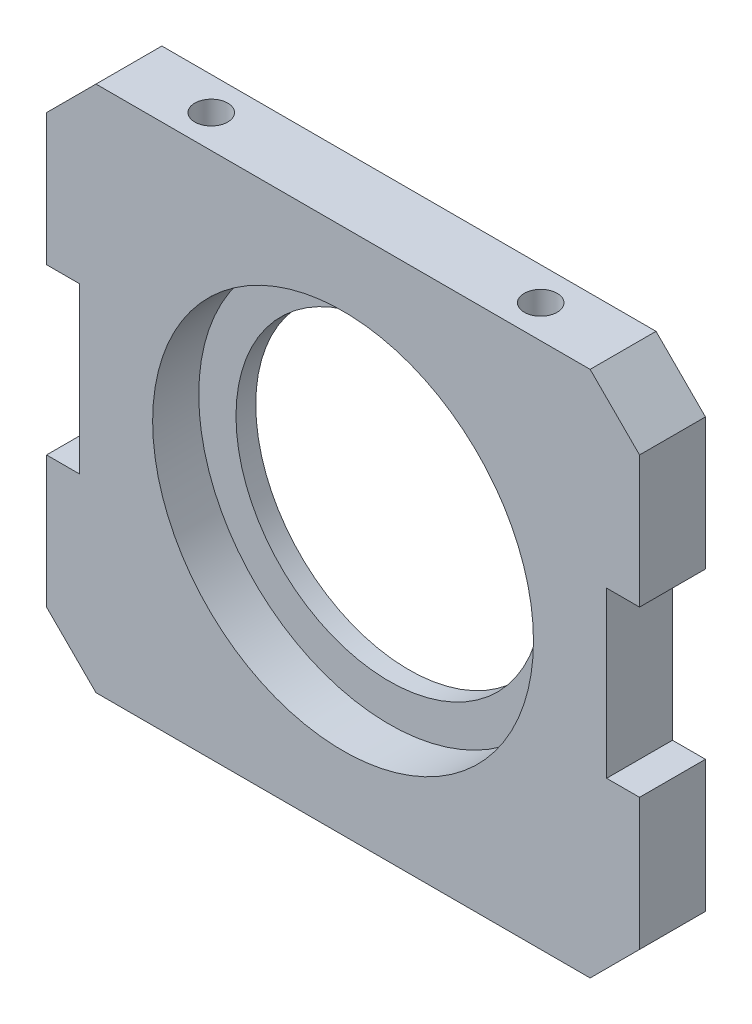
ISO-10303-21;
HEADER;
FILE_DESCRIPTION(('STEP AP214'),'2;1');
FILE_NAME('part.step','',(''),(''),'','','');
FILE_SCHEMA(('AUTOMOTIVE_DESIGN { 1 0 10303 214 1 1 1 1 }'));
ENDSEC;
DATA;
#1=APPLICATION_CONTEXT('core data for automotive mechanical design processes');
#2=APPLICATION_PROTOCOL_DEFINITION('international standard','automotive_design',2000,#1);
#3=PRODUCT_CONTEXT('',#1,'mechanical');
#4=PRODUCT('Part','Part','',(#3));
#5=PRODUCT_RELATED_PRODUCT_CATEGORY('part','',(#4));
#6=PRODUCT_DEFINITION_FORMATION('','',#4);
#7=PRODUCT_DEFINITION_CONTEXT('part definition',#1,'design');
#8=PRODUCT_DEFINITION('design','',#6,#7);
#9=PRODUCT_DEFINITION_SHAPE('','',#8);
#10=(LENGTH_UNIT() NAMED_UNIT(*) SI_UNIT(.MILLI.,.METRE.));
#11=(NAMED_UNIT(*) PLANE_ANGLE_UNIT() SI_UNIT($,.RADIAN.));
#12=(NAMED_UNIT(*) SI_UNIT($,.STERADIAN.) SOLID_ANGLE_UNIT());
#13=UNCERTAINTY_MEASURE_WITH_UNIT(LENGTH_MEASURE(1.E-05),#10,'distance_accuracy_value','');
#14=(GEOMETRIC_REPRESENTATION_CONTEXT(3) GLOBAL_UNCERTAINTY_ASSIGNED_CONTEXT((#13)) GLOBAL_UNIT_ASSIGNED_CONTEXT((#10,
#11,#12)) REPRESENTATION_CONTEXT('',''));
#15=CARTESIAN_POINT('',(0.,0.,0.));
#16=DIRECTION('',(0.,0.,1.));
#17=DIRECTION('',(1.,0.,0.));
#18=AXIS2_PLACEMENT_3D('',#15,#16,#17);
#19=CARTESIAN_POINT('',(45.,-40.,5.));
#20=DIRECTION('',(-1.,0.,0.));
#21=DIRECTION('',(0.,0.,1.));
#22=AXIS2_PLACEMENT_3D('',#19,#20,#21);
#23=PLANE('',#22);
#24=DIRECTION('',(0.,1.,0.));
#25=VECTOR('',#24,1.);
#26=CARTESIAN_POINT('',(45.,-40.,5.));
#27=LINE('',#26,#25);
#28=CARTESIAN_POINT('',(45.,-32.5,5.));
#29=VERTEX_POINT('',#28);
#30=CARTESIAN_POINT('',(45.,-12.5,5.));
#31=VERTEX_POINT('',#30);
#32=EDGE_CURVE('E235',#29,#31,#27,.T.);
#33=ORIENTED_EDGE('',*,*,#32,.F.);
#34=DIRECTION('',(0.,0.,-1.));
#35=VECTOR('',#34,1.);
#36=CARTESIAN_POINT('',(45.,-32.5,5.));
#37=LINE('',#36,#35);
#38=CARTESIAN_POINT('',(45.,-32.5,-5.));
#39=VERTEX_POINT('',#38);
#40=EDGE_CURVE('E288',#29,#39,#37,.T.);
#41=ORIENTED_EDGE('',*,*,#40,.T.);
#42=DIRECTION('',(0.,1.,0.));
#43=VECTOR('',#42,1.);
#44=CARTESIAN_POINT('',(45.,-40.,-5.));
#45=LINE('',#44,#43);
#46=CARTESIAN_POINT('',(45.,-12.5,-5.));
#47=VERTEX_POINT('',#46);
#48=EDGE_CURVE('E246',#39,#47,#45,.T.);
#49=ORIENTED_EDGE('',*,*,#48,.T.);
#50=DIRECTION('',(0.,0.,1.));
#51=VECTOR('',#50,1.);
#52=CARTESIAN_POINT('',(45.,-12.5,5.));
#53=LINE('',#52,#51);
#54=EDGE_CURVE('E263',#47,#31,#53,.T.);
#55=ORIENTED_EDGE('',*,*,#54,.T.);
#56=EDGE_LOOP('',(#33,#41,#49,#55));
#57=FACE_BOUND('',#56,.T.);
#58=ADVANCED_FACE('F43',(#57),#23,.F.);
#59=CARTESIAN_POINT('',(-45.,-40.,5.));
#60=DIRECTION('',(1.,0.,0.));
#61=DIRECTION('',(0.,0.,-1.));
#62=AXIS2_PLACEMENT_3D('',#59,#60,#61);
#63=PLANE('',#62);
#64=DIRECTION('',(0.,-1.,0.));
#65=VECTOR('',#64,1.);
#66=CARTESIAN_POINT('',(-45.,-40.,-5.));
#67=LINE('',#66,#65);
#68=CARTESIAN_POINT('',(-45.,-12.5,-5.));
#69=VERTEX_POINT('',#68);
#70=CARTESIAN_POINT('',(-45.,-32.5,-5.));
#71=VERTEX_POINT('',#70);
#72=EDGE_CURVE('E250',#69,#71,#67,.T.);
#73=ORIENTED_EDGE('',*,*,#72,.T.);
#74=DIRECTION('',(0.,0.,1.));
#75=VECTOR('',#74,1.);
#76=CARTESIAN_POINT('',(-45.,-32.5,5.));
#77=LINE('',#76,#75);
#78=CARTESIAN_POINT('',(-45.,-32.5,5.));
#79=VERTEX_POINT('',#78);
#80=EDGE_CURVE('E279',#71,#79,#77,.T.);
#81=ORIENTED_EDGE('',*,*,#80,.T.);
#82=DIRECTION('',(0.,-1.,0.));
#83=VECTOR('',#82,1.);
#84=CARTESIAN_POINT('',(-45.,-40.,5.));
#85=LINE('',#84,#83);
#86=CARTESIAN_POINT('',(-45.,-12.5,5.));
#87=VERTEX_POINT('',#86);
#88=EDGE_CURVE('E240',#87,#79,#85,.T.);
#89=ORIENTED_EDGE('',*,*,#88,.F.);
#90=DIRECTION('',(0.,0.,-1.));
#91=VECTOR('',#90,1.);
#92=CARTESIAN_POINT('',(-45.,-12.5,5.));
#93=LINE('',#92,#91);
#94=EDGE_CURVE('E257',#87,#69,#93,.T.);
#95=ORIENTED_EDGE('',*,*,#94,.T.);
#96=EDGE_LOOP('',(#73,#81,#89,#95));
#97=FACE_BOUND('',#96,.T.);
#98=ADVANCED_FACE('F322',(#97),#63,.F.);
#99=CARTESIAN_POINT('',(0.,0.,5.));
#100=DIRECTION('',(0.,0.,-1.));
#101=DIRECTION('',(-1.,0.,0.));
#102=AXIS2_PLACEMENT_3D('',#99,#100,#101);
#103=CYLINDRICAL_SURFACE('',#102,28.9);
#104=CARTESIAN_POINT('',(0.,0.,5.));
#105=DIRECTION('',(0.,0.,1.));
#106=DIRECTION('',(1.,0.,0.));
#107=AXIS2_PLACEMENT_3D('',#104,#105,#106);
#108=CIRCLE('',#107,28.9);
#109=CARTESIAN_POINT('',(28.9,0.,5.));
#110=VERTEX_POINT('',#109);
#111=EDGE_CURVE('E231',#110,#110,#108,.T.);
#112=ORIENTED_EDGE('',*,*,#111,.T.);
#113=EDGE_LOOP('',(#112));
#114=FACE_BOUND('',#113,.T.);
#115=CARTESIAN_POINT('',(0.,0.,-2.));
#116=DIRECTION('',(0.,0.,-1.));
#117=DIRECTION('',(-1.,0.,0.));
#118=AXIS2_PLACEMENT_3D('',#115,#116,#117);
#119=CIRCLE('',#118,28.9);
#120=CARTESIAN_POINT('',(-28.9,0.,-2.));
#121=VERTEX_POINT('',#120);
#122=EDGE_CURVE('E226',#121,#121,#119,.T.);
#123=ORIENTED_EDGE('',*,*,#122,.T.);
#124=EDGE_LOOP('',(#123));
#125=FACE_BOUND('',#124,.T.);
#126=ADVANCED_FACE('F362',(#114,#125),#103,.F.);
#127=CARTESIAN_POINT('',(0.,0.,5.));
#128=DIRECTION('',(0.,0.,-1.));
#129=DIRECTION('',(-1.,0.,0.));
#130=AXIS2_PLACEMENT_3D('',#127,#128,#129);
#131=PLANE('',#130);
#132=ORIENTED_EDGE('',*,*,#88,.T.);
#133=DIRECTION('',(-0.707106781186546,0.70710678118655,0.));
#134=VECTOR('',#133,1.);
#135=CARTESIAN_POINT('',(-37.5,-40.,5.));
#136=LINE('',#135,#134);
#137=CARTESIAN_POINT('',(-37.5,-40.,5.));
#138=VERTEX_POINT('',#137);
#139=EDGE_CURVE('E286',#79,#138,#136,.F.);
#140=ORIENTED_EDGE('',*,*,#139,.T.);
#141=DIRECTION('',(1.,0.,0.));
#142=VECTOR('',#141,1.);
#143=CARTESIAN_POINT('',(-45.,-40.,5.));
#144=LINE('',#143,#142);
#145=CARTESIAN_POINT('',(37.4999999999999,-40.,5.));
#146=VERTEX_POINT('',#145);
#147=EDGE_CURVE('E243',#138,#146,#144,.T.);
#148=ORIENTED_EDGE('',*,*,#147,.T.);
#149=DIRECTION('',(-0.70710678118655,-0.707106781186546,0.));
#150=VECTOR('',#149,1.);
#151=CARTESIAN_POINT('',(45.,-32.5,5.));
#152=LINE('',#151,#150);
#153=EDGE_CURVE('E284',#146,#29,#152,.F.);
#154=ORIENTED_EDGE('',*,*,#153,.T.);
#155=ORIENTED_EDGE('',*,*,#32,.T.);
#156=DIRECTION('',(1.,0.,0.));
#157=VECTOR('',#156,1.);
#158=CARTESIAN_POINT('',(50.,-12.5,5.));
#159=LINE('',#158,#157);
#160=CARTESIAN_POINT('',(40.,-12.5,5.));
#161=VERTEX_POINT('',#160);
#162=EDGE_CURVE('E208',#161,#31,#159,.T.);
#163=ORIENTED_EDGE('',*,*,#162,.F.);
#164=DIRECTION('',(0.,-1.,0.));
#165=VECTOR('',#164,1.);
#166=CARTESIAN_POINT('',(40.,-12.5,5.));
#167=LINE('',#166,#165);
#168=CARTESIAN_POINT('',(40.,12.5,5.));
#169=VERTEX_POINT('',#168);
#170=EDGE_CURVE('E211',#169,#161,#167,.T.);
#171=ORIENTED_EDGE('',*,*,#170,.F.);
#172=DIRECTION('',(-1.,0.,0.));
#173=VECTOR('',#172,1.);
#174=CARTESIAN_POINT('',(50.,12.5,5.));
#175=LINE('',#174,#173);
#176=CARTESIAN_POINT('',(45.,12.5,5.));
#177=VERTEX_POINT('',#176);
#178=EDGE_CURVE('E197',#177,#169,#175,.T.);
#179=ORIENTED_EDGE('',*,*,#178,.F.);
#180=CARTESIAN_POINT('',(45.,32.5,5.));
#181=VERTEX_POINT('',#180);
#182=EDGE_CURVE('E238',#177,#181,#27,.T.);
#183=ORIENTED_EDGE('',*,*,#182,.T.);
#184=DIRECTION('',(0.707106781186546,-0.70710678118655,0.));
#185=VECTOR('',#184,1.);
#186=CARTESIAN_POINT('',(37.5,40.,5.));
#187=LINE('',#186,#185);
#188=CARTESIAN_POINT('',(37.5,40.,5.));
#189=VERTEX_POINT('',#188);
#190=EDGE_CURVE('E282',#181,#189,#187,.F.);
#191=ORIENTED_EDGE('',*,*,#190,.T.);
#192=DIRECTION('',(-1.,0.,0.));
#193=VECTOR('',#192,1.);
#194=CARTESIAN_POINT('',(-45.,40.,5.));
#195=LINE('',#194,#193);
#196=CARTESIAN_POINT('',(-37.5,40.,5.));
#197=VERTEX_POINT('',#196);
#198=EDGE_CURVE('E237',#189,#197,#195,.T.);
#199=ORIENTED_EDGE('',*,*,#198,.T.);
#200=DIRECTION('',(0.70710678118655,0.707106781186546,0.));
#201=VECTOR('',#200,1.);
#202=CARTESIAN_POINT('',(-45.,32.5,5.));
#203=LINE('',#202,#201);
#204=CARTESIAN_POINT('',(-45.,32.5,5.));
#205=VERTEX_POINT('',#204);
#206=EDGE_CURVE('E59',#197,#205,#203,.F.);
#207=ORIENTED_EDGE('',*,*,#206,.T.);
#208=CARTESIAN_POINT('',(-45.,12.5,5.));
#209=VERTEX_POINT('',#208);
#210=EDGE_CURVE('E241',#205,#209,#85,.T.);
#211=ORIENTED_EDGE('',*,*,#210,.T.);
#212=DIRECTION('',(-1.,0.,0.));
#213=VECTOR('',#212,1.);
#214=CARTESIAN_POINT('',(-50.,12.5,5.));
#215=LINE('',#214,#213);
#216=CARTESIAN_POINT('',(-40.,12.5,5.));
#217=VERTEX_POINT('',#216);
#218=EDGE_CURVE('E189',#217,#209,#215,.T.);
#219=ORIENTED_EDGE('',*,*,#218,.F.);
#220=DIRECTION('',(0.,1.,0.));
#221=VECTOR('',#220,1.);
#222=CARTESIAN_POINT('',(-40.,-12.5,5.));
#223=LINE('',#222,#221);
#224=CARTESIAN_POINT('',(-40.,-12.5,5.));
#225=VERTEX_POINT('',#224);
#226=EDGE_CURVE('E167',#225,#217,#223,.T.);
#227=ORIENTED_EDGE('',*,*,#226,.F.);
#228=DIRECTION('',(1.,0.,0.));
#229=VECTOR('',#228,1.);
#230=CARTESIAN_POINT('',(-50.,-12.5,5.));
#231=LINE('',#230,#229);
#232=EDGE_CURVE('E187',#87,#225,#231,.T.);
#233=ORIENTED_EDGE('',*,*,#232,.F.);
#234=EDGE_LOOP('',(#132,#140,#148,#154,#155,#163,#171,#179,#183,#191,#199,#207,#211,#219,#227,#233));
#235=FACE_BOUND('',#234,.T.);
#236=ORIENTED_EDGE('',*,*,#111,.F.);
#237=EDGE_LOOP('',(#236));
#238=FACE_BOUND('',#237,.T.);
#239=ADVANCED_FACE('F305',(#235,#238),#131,.F.);
#240=CARTESIAN_POINT('',(0.,0.,-5.));
#241=DIRECTION('',(0.,0.,-1.));
#242=DIRECTION('',(-1.,0.,0.));
#243=AXIS2_PLACEMENT_3D('',#240,#241,#242);
#244=PLANE('',#243);
#245=DIRECTION('',(1.,0.,0.));
#246=VECTOR('',#245,1.);
#247=CARTESIAN_POINT('',(-45.,-40.,-5.));
#248=LINE('',#247,#246);
#249=CARTESIAN_POINT('',(-37.5,-40.,-5.));
#250=VERTEX_POINT('',#249);
#251=CARTESIAN_POINT('',(37.4999999999999,-40.,-5.));
#252=VERTEX_POINT('',#251);
#253=EDGE_CURVE('E253',#250,#252,#248,.T.);
#254=ORIENTED_EDGE('',*,*,#253,.F.);
#255=DIRECTION('',(0.707106781186546,-0.70710678118655,0.));
#256=VECTOR('',#255,1.);
#257=CARTESIAN_POINT('',(-38.7500000000001,-38.7499999999999,-5.));
#258=LINE('',#257,#256);
#259=EDGE_CURVE('E277',#250,#71,#258,.F.);
#260=ORIENTED_EDGE('',*,*,#259,.T.);
#261=ORIENTED_EDGE('',*,*,#72,.F.);
#262=DIRECTION('',(1.,0.,0.));
#263=VECTOR('',#262,1.);
#264=CARTESIAN_POINT('',(-50.,-12.5,-5.));
#265=LINE('',#264,#263);
#266=CARTESIAN_POINT('',(-40.,-12.5,-5.));
#267=VERTEX_POINT('',#266);
#268=EDGE_CURVE('E172',#69,#267,#265,.T.);
#269=ORIENTED_EDGE('',*,*,#268,.T.);
#270=DIRECTION('',(0.,1.,0.));
#271=VECTOR('',#270,1.);
#272=CARTESIAN_POINT('',(-40.,-12.5,-5.));
#273=LINE('',#272,#271);
#274=CARTESIAN_POINT('',(-40.,12.5,-5.));
#275=VERTEX_POINT('',#274);
#276=EDGE_CURVE('E164',#267,#275,#273,.T.);
#277=ORIENTED_EDGE('',*,*,#276,.T.);
#278=DIRECTION('',(-1.,0.,0.));
#279=VECTOR('',#278,1.);
#280=CARTESIAN_POINT('',(-50.,12.5,-5.));
#281=LINE('',#280,#279);
#282=CARTESIAN_POINT('',(-45.,12.5,-5.));
#283=VERTEX_POINT('',#282);
#284=EDGE_CURVE('E176',#275,#283,#281,.T.);
#285=ORIENTED_EDGE('',*,*,#284,.T.);
#286=CARTESIAN_POINT('',(-45.,32.5,-5.));
#287=VERTEX_POINT('',#286);
#288=EDGE_CURVE('E251',#287,#283,#67,.T.);
#289=ORIENTED_EDGE('',*,*,#288,.F.);
#290=DIRECTION('',(-0.70710678118655,-0.707106781186546,0.));
#291=VECTOR('',#290,1.);
#292=CARTESIAN_POINT('',(-38.7499999999999,38.7500000000001,-5.));
#293=LINE('',#292,#291);
#294=CARTESIAN_POINT('',(-37.5,40.,-5.));
#295=VERTEX_POINT('',#294);
#296=EDGE_CURVE('E271',#287,#295,#293,.F.);
#297=ORIENTED_EDGE('',*,*,#296,.T.);
#298=DIRECTION('',(-1.,0.,0.));
#299=VECTOR('',#298,1.);
#300=CARTESIAN_POINT('',(-45.,40.,-5.));
#301=LINE('',#300,#299);
#302=CARTESIAN_POINT('',(37.5,40.,-5.));
#303=VERTEX_POINT('',#302);
#304=EDGE_CURVE('E248',#303,#295,#301,.T.);
#305=ORIENTED_EDGE('',*,*,#304,.F.);
#306=DIRECTION('',(-0.707106781186546,0.70710678118655,0.));
#307=VECTOR('',#306,1.);
#308=CARTESIAN_POINT('',(38.7500000000001,38.7499999999999,-5.));
#309=LINE('',#308,#307);
#310=CARTESIAN_POINT('',(45.,32.5,-5.));
#311=VERTEX_POINT('',#310);
#312=EDGE_CURVE('E273',#303,#311,#309,.F.);
#313=ORIENTED_EDGE('',*,*,#312,.T.);
#314=CARTESIAN_POINT('',(45.,12.5,-5.));
#315=VERTEX_POINT('',#314);
#316=EDGE_CURVE('E234',#315,#311,#45,.T.);
#317=ORIENTED_EDGE('',*,*,#316,.F.);
#318=DIRECTION('',(-1.,0.,0.));
#319=VECTOR('',#318,1.);
#320=CARTESIAN_POINT('',(50.,12.5,-5.));
#321=LINE('',#320,#319);
#322=CARTESIAN_POINT('',(40.,12.5,-5.));
#323=VERTEX_POINT('',#322);
#324=EDGE_CURVE('E212',#315,#323,#321,.T.);
#325=ORIENTED_EDGE('',*,*,#324,.T.);
#326=DIRECTION('',(0.,-1.,0.));
#327=VECTOR('',#326,1.);
#328=CARTESIAN_POINT('',(40.,-12.5,-5.));
#329=LINE('',#328,#327);
#330=CARTESIAN_POINT('',(40.,-12.5,-5.));
#331=VERTEX_POINT('',#330);
#332=EDGE_CURVE('E218',#323,#331,#329,.T.);
#333=ORIENTED_EDGE('',*,*,#332,.T.);
#334=DIRECTION('',(1.,0.,0.));
#335=VECTOR('',#334,1.);
#336=CARTESIAN_POINT('',(50.,-12.5,-5.));
#337=LINE('',#336,#335);
#338=EDGE_CURVE('E204',#331,#47,#337,.T.);
#339=ORIENTED_EDGE('',*,*,#338,.T.);
#340=ORIENTED_EDGE('',*,*,#48,.F.);
#341=DIRECTION('',(0.70710678118655,0.707106781186546,0.));
#342=VECTOR('',#341,1.);
#343=CARTESIAN_POINT('',(38.7499999999999,-38.7500000000001,-5.));
#344=LINE('',#343,#342);
#345=EDGE_CURVE('E275',#39,#252,#344,.F.);
#346=ORIENTED_EDGE('',*,*,#345,.T.);
#347=EDGE_LOOP('',(#254,#260,#261,#269,#277,#285,#289,#297,#305,#313,#317,#325,#333,#339,#340,#346));
#348=FACE_BOUND('',#347,.T.);
#349=CARTESIAN_POINT('',(0.,0.,-5.));
#350=DIRECTION('',(0.,0.,-1.));
#351=DIRECTION('',(-1.,0.,0.));
#352=AXIS2_PLACEMENT_3D('',#349,#350,#351);
#353=CIRCLE('',#352,23.25);
#354=CARTESIAN_POINT('',(-23.25,0.,-5.));
#355=VERTEX_POINT('',#354);
#356=EDGE_CURVE('E199',#355,#355,#353,.T.);
#357=ORIENTED_EDGE('',*,*,#356,.F.);
#358=EDGE_LOOP('',(#357));
#359=FACE_BOUND('',#358,.T.);
#360=ADVANCED_FACE('F184',(#348,#359),#244,.T.);
#361=ORIENTED_EDGE('',*,*,#316,.T.);
#362=DIRECTION('',(0.,0.,1.));
#363=VECTOR('',#362,1.);
#364=CARTESIAN_POINT('',(45.,32.5,5.));
#365=LINE('',#364,#363);
#366=EDGE_CURVE('E52',#311,#181,#365,.T.);
#367=ORIENTED_EDGE('',*,*,#366,.T.);
#368=ORIENTED_EDGE('',*,*,#182,.F.);
#369=DIRECTION('',(0.,0.,-1.));
#370=VECTOR('',#369,1.);
#371=CARTESIAN_POINT('',(45.,12.5,5.));
#372=LINE('',#371,#370);
#373=EDGE_CURVE('E260',#177,#315,#372,.T.);
#374=ORIENTED_EDGE('',*,*,#373,.T.);
#375=EDGE_LOOP('',(#361,#367,#368,#374));
#376=FACE_BOUND('',#375,.T.);
#377=ADVANCED_FACE('F299',(#376),#23,.F.);
#378=CARTESIAN_POINT('',(-45.,40.,5.));
#379=DIRECTION('',(0.,-1.,0.));
#380=DIRECTION('',(0.,0.,-1.));
#381=AXIS2_PLACEMENT_3D('',#378,#379,#380);
#382=PLANE('',#381);
#383=CARTESIAN_POINT('',(-25.,40.,0.));
#384=DIRECTION('',(0.,-1.,0.));
#385=DIRECTION('',(0.,0.,-1.));
#386=AXIS2_PLACEMENT_3D('',#383,#384,#385);
#387=CIRCLE('',#386,2.5);
#388=CARTESIAN_POINT('',(-25.,40.,-2.5));
#389=VERTEX_POINT('',#388);
#390=EDGE_CURVE('E614',#389,#389,#387,.T.);
#391=ORIENTED_EDGE('',*,*,#390,.T.);
#392=EDGE_LOOP('',(#391));
#393=FACE_BOUND('',#392,.T.);
#394=CARTESIAN_POINT('',(25.,40.,0.));
#395=DIRECTION('',(0.,-1.,0.));
#396=DIRECTION('',(0.,0.,-1.));
#397=AXIS2_PLACEMENT_3D('',#394,#395,#396);
#398=CIRCLE('',#397,2.5);
#399=CARTESIAN_POINT('',(25.,40.,-2.49999999999999));
#400=VERTEX_POINT('',#399);
#401=EDGE_CURVE('E624',#400,#400,#398,.T.);
#402=ORIENTED_EDGE('',*,*,#401,.T.);
#403=EDGE_LOOP('',(#402));
#404=FACE_BOUND('',#403,.T.);
#405=ORIENTED_EDGE('',*,*,#198,.F.);
#406=DIRECTION('',(0.,0.,-1.));
#407=VECTOR('',#406,1.);
#408=CARTESIAN_POINT('',(37.5,40.,5.));
#409=LINE('',#408,#407);
#410=EDGE_CURVE('E292',#189,#303,#409,.T.);
#411=ORIENTED_EDGE('',*,*,#410,.T.);
#412=ORIENTED_EDGE('',*,*,#304,.T.);
#413=DIRECTION('',(0.,0.,1.));
#414=VECTOR('',#413,1.);
#415=CARTESIAN_POINT('',(-37.5,40.,5.));
#416=LINE('',#415,#414);
#417=EDGE_CURVE('E67',#295,#197,#416,.T.);
#418=ORIENTED_EDGE('',*,*,#417,.T.);
#419=EDGE_LOOP('',(#405,#411,#412,#418));
#420=FACE_BOUND('',#419,.T.);
#421=ADVANCED_FACE('F311',(#393,#404,#420),#382,.F.);
#422=ORIENTED_EDGE('',*,*,#210,.F.);
#423=DIRECTION('',(0.,0.,-1.));
#424=VECTOR('',#423,1.);
#425=CARTESIAN_POINT('',(-45.,32.5,5.));
#426=LINE('',#425,#424);
#427=EDGE_CURVE('E11',#205,#287,#426,.T.);
#428=ORIENTED_EDGE('',*,*,#427,.T.);
#429=ORIENTED_EDGE('',*,*,#288,.T.);
#430=DIRECTION('',(0.,0.,1.));
#431=VECTOR('',#430,1.);
#432=CARTESIAN_POINT('',(-45.,12.5,5.));
#433=LINE('',#432,#431);
#434=EDGE_CURVE('E179',#283,#209,#433,.T.);
#435=ORIENTED_EDGE('',*,*,#434,.T.);
#436=EDGE_LOOP('',(#422,#428,#429,#435));
#437=FACE_BOUND('',#436,.T.);
#438=ADVANCED_FACE('F315',(#437),#63,.F.);
#439=CARTESIAN_POINT('',(-45.,-40.,5.));
#440=DIRECTION('',(0.,1.,0.));
#441=DIRECTION('',(0.,0.,1.));
#442=AXIS2_PLACEMENT_3D('',#439,#440,#441);
#443=PLANE('',#442);
#444=CARTESIAN_POINT('',(-25.,-40.,0.));
#445=DIRECTION('',(0.,-1.,0.));
#446=DIRECTION('',(0.,0.,-1.));
#447=AXIS2_PLACEMENT_3D('',#444,#445,#446);
#448=CIRCLE('',#447,2.5);
#449=CARTESIAN_POINT('',(-25.,-40.,-2.5));
#450=VERTEX_POINT('',#449);
#451=EDGE_CURVE('E629',#450,#450,#448,.T.);
#452=ORIENTED_EDGE('',*,*,#451,.F.);
#453=EDGE_LOOP('',(#452));
#454=FACE_BOUND('',#453,.T.);
#455=CARTESIAN_POINT('',(25.,-40.,0.));
#456=DIRECTION('',(0.,-1.,0.));
#457=DIRECTION('',(0.,0.,-1.));
#458=AXIS2_PLACEMENT_3D('',#455,#456,#457);
#459=CIRCLE('',#458,2.5);
#460=CARTESIAN_POINT('',(25.,-40.,-2.49999999999999));
#461=VERTEX_POINT('',#460);
#462=EDGE_CURVE('E617',#461,#461,#459,.T.);
#463=ORIENTED_EDGE('',*,*,#462,.F.);
#464=EDGE_LOOP('',(#463));
#465=FACE_BOUND('',#464,.T.);
#466=ORIENTED_EDGE('',*,*,#147,.F.);
#467=DIRECTION('',(0.,0.,-1.));
#468=VECTOR('',#467,1.);
#469=CARTESIAN_POINT('',(-37.5,-40.,5.));
#470=LINE('',#469,#468);
#471=EDGE_CURVE('E268',#138,#250,#470,.T.);
#472=ORIENTED_EDGE('',*,*,#471,.T.);
#473=ORIENTED_EDGE('',*,*,#253,.T.);
#474=DIRECTION('',(0.,0.,1.));
#475=VECTOR('',#474,1.);
#476=CARTESIAN_POINT('',(37.5,-40.,5.));
#477=LINE('',#476,#475);
#478=EDGE_CURVE('E266',#252,#146,#477,.T.);
#479=ORIENTED_EDGE('',*,*,#478,.T.);
#480=EDGE_LOOP('',(#466,#472,#473,#479));
#481=FACE_BOUND('',#480,.T.);
#482=ADVANCED_FACE('F330',(#454,#465,#481),#443,.F.);
#483=CARTESIAN_POINT('',(0.,0.,-2.));
#484=DIRECTION('',(0.,0.,-1.));
#485=DIRECTION('',(-1.,0.,0.));
#486=AXIS2_PLACEMENT_3D('',#483,#484,#485);
#487=PLANE('',#486);
#488=CARTESIAN_POINT('',(0.,0.,-2.));
#489=DIRECTION('',(0.,0.,-1.));
#490=DIRECTION('',(-1.,0.,0.));
#491=AXIS2_PLACEMENT_3D('',#488,#489,#490);
#492=CIRCLE('',#491,23.25);
#493=CARTESIAN_POINT('',(-23.25,0.,-2.));
#494=VERTEX_POINT('',#493);
#495=EDGE_CURVE('E223',#494,#494,#492,.T.);
#496=ORIENTED_EDGE('',*,*,#495,.T.);
#497=EDGE_LOOP('',(#496));
#498=FACE_BOUND('',#497,.T.);
#499=ORIENTED_EDGE('',*,*,#122,.F.);
#500=EDGE_LOOP('',(#499));
#501=FACE_BOUND('',#500,.T.);
#502=ADVANCED_FACE('F381',(#498,#501),#487,.F.);
#503=CARTESIAN_POINT('',(0.,0.,-2.));
#504=DIRECTION('',(0.,0.,-1.));
#505=DIRECTION('',(-1.,0.,0.));
#506=AXIS2_PLACEMENT_3D('',#503,#504,#505);
#507=CYLINDRICAL_SURFACE('',#506,23.25);
#508=ORIENTED_EDGE('',*,*,#495,.F.);
#509=EDGE_LOOP('',(#508));
#510=FACE_BOUND('',#509,.T.);
#511=ORIENTED_EDGE('',*,*,#356,.T.);
#512=EDGE_LOOP('',(#511));
#513=FACE_BOUND('',#512,.T.);
#514=ADVANCED_FACE('F540',(#510,#513),#507,.F.);
#515=CARTESIAN_POINT('',(-50.,-12.5,-5.));
#516=DIRECTION('',(0.,-1.,0.));
#517=DIRECTION('',(0.,0.,-1.));
#518=AXIS2_PLACEMENT_3D('',#515,#516,#517);
#519=PLANE('',#518);
#520=ORIENTED_EDGE('',*,*,#232,.T.);
#521=DIRECTION('',(0.,0.,1.));
#522=VECTOR('',#521,1.);
#523=CARTESIAN_POINT('',(-40.,-12.5,-5.));
#524=LINE('',#523,#522);
#525=EDGE_CURVE('E171',#267,#225,#524,.T.);
#526=ORIENTED_EDGE('',*,*,#525,.F.);
#527=ORIENTED_EDGE('',*,*,#268,.F.);
#528=ORIENTED_EDGE('',*,*,#94,.F.);
#529=EDGE_LOOP('',(#520,#526,#527,#528));
#530=FACE_BOUND('',#529,.T.);
#531=ADVANCED_FACE('F533',(#530),#519,.F.);
#532=CARTESIAN_POINT('',(-50.,12.5,-5.));
#533=DIRECTION('',(0.,1.,0.));
#534=DIRECTION('',(0.,0.,1.));
#535=AXIS2_PLACEMENT_3D('',#532,#533,#534);
#536=PLANE('',#535);
#537=ORIENTED_EDGE('',*,*,#284,.F.);
#538=DIRECTION('',(0.,0.,1.));
#539=VECTOR('',#538,1.);
#540=CARTESIAN_POINT('',(-40.,12.5,-5.));
#541=LINE('',#540,#539);
#542=EDGE_CURVE('E159',#275,#217,#541,.T.);
#543=ORIENTED_EDGE('',*,*,#542,.T.);
#544=ORIENTED_EDGE('',*,*,#218,.T.);
#545=ORIENTED_EDGE('',*,*,#434,.F.);
#546=EDGE_LOOP('',(#537,#543,#544,#545));
#547=FACE_BOUND('',#546,.T.);
#548=ADVANCED_FACE('F177',(#547),#536,.F.);
#549=CARTESIAN_POINT('',(-40.,-12.5,-5.));
#550=DIRECTION('',(1.,0.,0.));
#551=DIRECTION('',(0.,0.,-1.));
#552=AXIS2_PLACEMENT_3D('',#549,#550,#551);
#553=PLANE('',#552);
#554=ORIENTED_EDGE('',*,*,#226,.T.);
#555=ORIENTED_EDGE('',*,*,#542,.F.);
#556=ORIENTED_EDGE('',*,*,#276,.F.);
#557=ORIENTED_EDGE('',*,*,#525,.T.);
#558=EDGE_LOOP('',(#554,#555,#556,#557));
#559=FACE_BOUND('',#558,.T.);
#560=ADVANCED_FACE('F161',(#559),#553,.F.);
#561=CARTESIAN_POINT('',(50.,-12.5,-5.));
#562=DIRECTION('',(0.,-1.,0.));
#563=DIRECTION('',(0.,0.,-1.));
#564=AXIS2_PLACEMENT_3D('',#561,#562,#563);
#565=PLANE('',#564);
#566=ORIENTED_EDGE('',*,*,#338,.F.);
#567=DIRECTION('',(0.,0.,1.));
#568=VECTOR('',#567,1.);
#569=CARTESIAN_POINT('',(40.,-12.5,-5.));
#570=LINE('',#569,#568);
#571=EDGE_CURVE('E205',#331,#161,#570,.T.);
#572=ORIENTED_EDGE('',*,*,#571,.T.);
#573=ORIENTED_EDGE('',*,*,#162,.T.);
#574=ORIENTED_EDGE('',*,*,#54,.F.);
#575=EDGE_LOOP('',(#566,#572,#573,#574));
#576=FACE_BOUND('',#575,.T.);
#577=ADVANCED_FACE('F342',(#576),#565,.F.);
#578=CARTESIAN_POINT('',(50.,12.5,-5.));
#579=DIRECTION('',(0.,1.,0.));
#580=DIRECTION('',(0.,0.,1.));
#581=AXIS2_PLACEMENT_3D('',#578,#579,#580);
#582=PLANE('',#581);
#583=ORIENTED_EDGE('',*,*,#178,.T.);
#584=DIRECTION('',(0.,0.,1.));
#585=VECTOR('',#584,1.);
#586=CARTESIAN_POINT('',(40.,12.5,-5.));
#587=LINE('',#586,#585);
#588=EDGE_CURVE('E201',#323,#169,#587,.T.);
#589=ORIENTED_EDGE('',*,*,#588,.F.);
#590=ORIENTED_EDGE('',*,*,#324,.F.);
#591=ORIENTED_EDGE('',*,*,#373,.F.);
#592=EDGE_LOOP('',(#583,#589,#590,#591));
#593=FACE_BOUND('',#592,.T.);
#594=ADVANCED_FACE('F347',(#593),#582,.F.);
#595=CARTESIAN_POINT('',(40.,-12.5,-5.));
#596=DIRECTION('',(-1.,0.,0.));
#597=DIRECTION('',(0.,0.,1.));
#598=AXIS2_PLACEMENT_3D('',#595,#596,#597);
#599=PLANE('',#598);
#600=ORIENTED_EDGE('',*,*,#170,.T.);
#601=ORIENTED_EDGE('',*,*,#571,.F.);
#602=ORIENTED_EDGE('',*,*,#332,.F.);
#603=ORIENTED_EDGE('',*,*,#588,.T.);
#604=EDGE_LOOP('',(#600,#601,#602,#603));
#605=FACE_BOUND('',#604,.T.);
#606=ADVANCED_FACE('F345',(#605),#599,.F.);
#607=CARTESIAN_POINT('',(-37.5,-40.,5.));
#608=DIRECTION('',(0.707106781186549,0.707106781186545,0.));
#609=DIRECTION('',(0.,0.,-1.));
#610=AXIS2_PLACEMENT_3D('',#607,#608,#609);
#611=PLANE('',#610);
#612=ORIENTED_EDGE('',*,*,#139,.F.);
#613=ORIENTED_EDGE('',*,*,#80,.F.);
#614=ORIENTED_EDGE('',*,*,#259,.F.);
#615=ORIENTED_EDGE('',*,*,#471,.F.);
#616=EDGE_LOOP('',(#612,#613,#614,#615));
#617=FACE_BOUND('',#616,.T.);
#618=ADVANCED_FACE('F325',(#617),#611,.F.);
#619=CARTESIAN_POINT('',(45.,-32.5,5.));
#620=DIRECTION('',(-0.707106781186545,0.707106781186549,0.));
#621=DIRECTION('',(0.,0.,-1.));
#622=AXIS2_PLACEMENT_3D('',#619,#620,#621);
#623=PLANE('',#622);
#624=ORIENTED_EDGE('',*,*,#153,.F.);
#625=ORIENTED_EDGE('',*,*,#478,.F.);
#626=ORIENTED_EDGE('',*,*,#345,.F.);
#627=ORIENTED_EDGE('',*,*,#40,.F.);
#628=EDGE_LOOP('',(#624,#625,#626,#627));
#629=FACE_BOUND('',#628,.T.);
#630=ADVANCED_FACE('F333',(#629),#623,.F.);
#631=CARTESIAN_POINT('',(37.5,40.,5.));
#632=DIRECTION('',(-0.707106781186549,-0.707106781186545,0.));
#633=DIRECTION('',(0.,0.,-1.));
#634=AXIS2_PLACEMENT_3D('',#631,#632,#633);
#635=PLANE('',#634);
#636=ORIENTED_EDGE('',*,*,#190,.F.);
#637=ORIENTED_EDGE('',*,*,#366,.F.);
#638=ORIENTED_EDGE('',*,*,#312,.F.);
#639=ORIENTED_EDGE('',*,*,#410,.F.);
#640=EDGE_LOOP('',(#636,#637,#638,#639));
#641=FACE_BOUND('',#640,.T.);
#642=ADVANCED_FACE('F309',(#641),#635,.F.);
#643=CARTESIAN_POINT('',(-45.,32.5,5.));
#644=DIRECTION('',(0.707106781186545,-0.707106781186549,0.));
#645=DIRECTION('',(0.,0.,-1.));
#646=AXIS2_PLACEMENT_3D('',#643,#644,#645);
#647=PLANE('',#646);
#648=ORIENTED_EDGE('',*,*,#206,.F.);
#649=ORIENTED_EDGE('',*,*,#417,.F.);
#650=ORIENTED_EDGE('',*,*,#296,.F.);
#651=ORIENTED_EDGE('',*,*,#427,.F.);
#652=EDGE_LOOP('',(#648,#649,#650,#651));
#653=FACE_BOUND('',#652,.T.);
#654=ADVANCED_FACE('F46',(#653),#647,.F.);
#655=CARTESIAN_POINT('',(25.,-30.,0.));
#656=DIRECTION('',(0.,-1.,0.));
#657=DIRECTION('',(0.,0.,-1.));
#658=AXIS2_PLACEMENT_3D('',#655,#656,#657);
#659=CYLINDRICAL_SURFACE('',#658,2.5);
#660=CARTESIAN_POINT('',(25.,-30.,0.));
#661=DIRECTION('',(0.,-1.,0.));
#662=DIRECTION('',(0.,0.,-1.));
#663=AXIS2_PLACEMENT_3D('',#660,#661,#662);
#664=CIRCLE('',#663,2.5);
#665=CARTESIAN_POINT('',(25.,-30.,-2.49999999999999));
#666=VERTEX_POINT('',#665);
#667=EDGE_CURVE('E192',#666,#666,#664,.T.);
#668=ORIENTED_EDGE('',*,*,#667,.F.);
#669=EDGE_LOOP('',(#668));
#670=FACE_BOUND('',#669,.T.);
#671=ORIENTED_EDGE('',*,*,#462,.T.);
#672=EDGE_LOOP('',(#671));
#673=FACE_BOUND('',#672,.T.);
#674=ADVANCED_FACE('F413',(#670,#673),#659,.F.);
#675=CARTESIAN_POINT('',(25.,-30.,0.));
#676=DIRECTION('',(0.,-1.,0.));
#677=DIRECTION('',(0.,0.,-1.));
#678=AXIS2_PLACEMENT_3D('',#675,#676,#677);
#679=PLANE('',#678);
#680=ORIENTED_EDGE('',*,*,#667,.T.);
#681=EDGE_LOOP('',(#680));
#682=FACE_BOUND('',#681,.T.);
#683=ADVANCED_FACE('F426',(#682),#679,.T.);
#684=CARTESIAN_POINT('',(-25.,-30.,0.));
#685=DIRECTION('',(0.,-1.,0.));
#686=DIRECTION('',(0.,0.,-1.));
#687=AXIS2_PLACEMENT_3D('',#684,#685,#686);
#688=CYLINDRICAL_SURFACE('',#687,2.5);
#689=CARTESIAN_POINT('',(-25.,-30.,0.));
#690=DIRECTION('',(0.,-1.,0.));
#691=DIRECTION('',(0.,0.,-1.));
#692=AXIS2_PLACEMENT_3D('',#689,#690,#691);
#693=CIRCLE('',#692,2.5);
#694=CARTESIAN_POINT('',(-25.,-30.,-2.5));
#695=VERTEX_POINT('',#694);
#696=EDGE_CURVE('E207',#695,#695,#693,.T.);
#697=ORIENTED_EDGE('',*,*,#696,.F.);
#698=EDGE_LOOP('',(#697));
#699=FACE_BOUND('',#698,.T.);
#700=ORIENTED_EDGE('',*,*,#451,.T.);
#701=EDGE_LOOP('',(#700));
#702=FACE_BOUND('',#701,.T.);
#703=ADVANCED_FACE('F435',(#699,#702),#688,.F.);
#704=CARTESIAN_POINT('',(-25.,-30.,0.));
#705=DIRECTION('',(0.,-1.,0.));
#706=DIRECTION('',(0.,0.,-1.));
#707=AXIS2_PLACEMENT_3D('',#704,#705,#706);
#708=PLANE('',#707);
#709=ORIENTED_EDGE('',*,*,#696,.T.);
#710=EDGE_LOOP('',(#709));
#711=FACE_BOUND('',#710,.T.);
#712=ADVANCED_FACE('F444',(#711),#708,.T.);
#713=CARTESIAN_POINT('',(25.,30.,0.));
#714=DIRECTION('',(0.,1.,0.));
#715=DIRECTION('',(0.,0.,1.));
#716=AXIS2_PLACEMENT_3D('',#713,#714,#715);
#717=CYLINDRICAL_SURFACE('',#716,2.5);
#718=CARTESIAN_POINT('',(25.,30.,0.));
#719=DIRECTION('',(0.,-1.,0.));
#720=DIRECTION('',(0.,0.,-1.));
#721=AXIS2_PLACEMENT_3D('',#718,#719,#720);
#722=CIRCLE('',#721,2.5);
#723=CARTESIAN_POINT('',(25.,30.,-2.49999999999999));
#724=VERTEX_POINT('',#723);
#725=EDGE_CURVE('E619',#724,#724,#722,.T.);
#726=ORIENTED_EDGE('',*,*,#725,.T.);
#727=EDGE_LOOP('',(#726));
#728=FACE_BOUND('',#727,.T.);
#729=ORIENTED_EDGE('',*,*,#401,.F.);
#730=EDGE_LOOP('',(#729));
#731=FACE_BOUND('',#730,.T.);
#732=ADVANCED_FACE('F452',(#728,#731),#717,.F.);
#733=CARTESIAN_POINT('',(25.,30.,0.));
#734=DIRECTION('',(0.,1.,0.));
#735=DIRECTION('',(0.,0.,-1.));
#736=AXIS2_PLACEMENT_3D('',#733,#734,#735);
#737=PLANE('',#736);
#738=ORIENTED_EDGE('',*,*,#725,.F.);
#739=EDGE_LOOP('',(#738));
#740=FACE_BOUND('',#739,.T.);
#741=ADVANCED_FACE('F466',(#740),#737,.T.);
#742=CARTESIAN_POINT('',(-25.,30.,0.));
#743=DIRECTION('',(0.,1.,0.));
#744=DIRECTION('',(0.,0.,1.));
#745=AXIS2_PLACEMENT_3D('',#742,#743,#744);
#746=CYLINDRICAL_SURFACE('',#745,2.5);
#747=CARTESIAN_POINT('',(-25.,30.,0.));
#748=DIRECTION('',(0.,-1.,0.));
#749=DIRECTION('',(0.,0.,-1.));
#750=AXIS2_PLACEMENT_3D('',#747,#748,#749);
#751=CIRCLE('',#750,2.5);
#752=CARTESIAN_POINT('',(-25.,30.,-2.5));
#753=VERTEX_POINT('',#752);
#754=EDGE_CURVE('E613',#753,#753,#751,.T.);
#755=ORIENTED_EDGE('',*,*,#754,.T.);
#756=EDGE_LOOP('',(#755));
#757=FACE_BOUND('',#756,.T.);
#758=ORIENTED_EDGE('',*,*,#390,.F.);
#759=EDGE_LOOP('',(#758));
#760=FACE_BOUND('',#759,.T.);
#761=ADVANCED_FACE('F475',(#757,#760),#746,.F.);
#762=CARTESIAN_POINT('',(-25.,30.,0.));
#763=DIRECTION('',(0.,1.,0.));
#764=DIRECTION('',(0.,0.,-1.));
#765=AXIS2_PLACEMENT_3D('',#762,#763,#764);
#766=PLANE('',#765);
#767=ORIENTED_EDGE('',*,*,#754,.F.);
#768=EDGE_LOOP('',(#767));
#769=FACE_BOUND('',#768,.T.);
#770=ADVANCED_FACE('F484',(#769),#766,.T.);
#771=CLOSED_SHELL('',(#58,#98,#126,#239,#360,#377,#421,#438,#482,#502,#514,#531,#548,#560,#577,
#594,#606,#618,#630,#642,#654,#674,#683,#703,#712,#732,#741,#761,#770));
#772=MANIFOLD_SOLID_BREP('B2',#771);
#773=ADVANCED_BREP_SHAPE_REPRESENTATION('',(#18,#772),#14);
#774=SHAPE_DEFINITION_REPRESENTATION(#9,#773);
ENDSEC;
END-ISO-10303-21;
